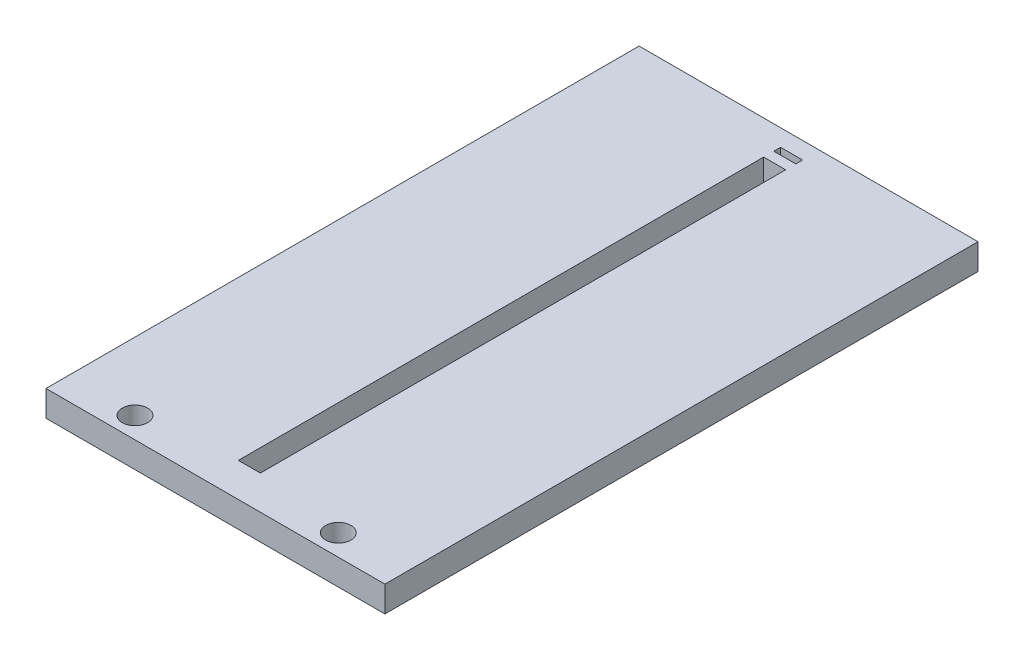
ISO-10303-21;
HEADER;
FILE_DESCRIPTION(('STEP AP214'),'2;1');
FILE_NAME('part.step','',(''),(''),'','','');
FILE_SCHEMA(('AUTOMOTIVE_DESIGN { 1 0 10303 214 1 1 1 1 }'));
ENDSEC;
DATA;
#1=APPLICATION_CONTEXT('core data for automotive mechanical design processes');
#2=APPLICATION_PROTOCOL_DEFINITION('international standard','automotive_design',2000,#1);
#3=PRODUCT_CONTEXT('',#1,'mechanical');
#4=PRODUCT('Part','Part','',(#3));
#5=PRODUCT_RELATED_PRODUCT_CATEGORY('part','',(#4));
#6=PRODUCT_DEFINITION_FORMATION('','',#4);
#7=PRODUCT_DEFINITION_CONTEXT('part definition',#1,'design');
#8=PRODUCT_DEFINITION('design','',#6,#7);
#9=PRODUCT_DEFINITION_SHAPE('','',#8);
#10=(LENGTH_UNIT() NAMED_UNIT(*) SI_UNIT(.MILLI.,.METRE.));
#11=(NAMED_UNIT(*) PLANE_ANGLE_UNIT() SI_UNIT($,.RADIAN.));
#12=(NAMED_UNIT(*) SI_UNIT($,.STERADIAN.) SOLID_ANGLE_UNIT());
#13=UNCERTAINTY_MEASURE_WITH_UNIT(LENGTH_MEASURE(1.E-05),#10,'distance_accuracy_value','');
#14=(GEOMETRIC_REPRESENTATION_CONTEXT(3) GLOBAL_UNCERTAINTY_ASSIGNED_CONTEXT((#13)) GLOBAL_UNIT_ASSIGNED_CONTEXT((#10,
#11,#12)) REPRESENTATION_CONTEXT('',''));
#15=CARTESIAN_POINT('',(0.,0.,0.));
#16=DIRECTION('',(0.,0.,1.));
#17=DIRECTION('',(1.,0.,0.));
#18=AXIS2_PLACEMENT_3D('',#15,#16,#17);
#19=CARTESIAN_POINT('',(0.,3.05,0.));
#20=DIRECTION('',(0.,0.,-1.));
#21=DIRECTION('',(-1.,0.,0.));
#22=AXIS2_PLACEMENT_3D('',#19,#20,#21);
#23=PLANE('',#22);
#24=DIRECTION('',(1.,0.,0.));
#25=VECTOR('',#24,1.);
#26=CARTESIAN_POINT('',(0.,0.,0.));
#27=LINE('',#26,#25);
#28=CARTESIAN_POINT('',(0.,0.,0.));
#29=VERTEX_POINT('',#28);
#30=CARTESIAN_POINT('',(40.,0.,0.));
#31=VERTEX_POINT('',#30);
#32=EDGE_CURVE('E172',#29,#31,#27,.T.);
#33=ORIENTED_EDGE('',*,*,#32,.T.);
#34=DIRECTION('',(0.,-1.,0.));
#35=VECTOR('',#34,1.);
#36=CARTESIAN_POINT('',(40.,3.05,0.));
#37=LINE('',#36,#35);
#38=CARTESIAN_POINT('',(40.,3.05,0.));
#39=VERTEX_POINT('',#38);
#40=EDGE_CURVE('E242',#39,#31,#37,.T.);
#41=ORIENTED_EDGE('',*,*,#40,.F.);
#42=DIRECTION('',(1.,0.,0.));
#43=VECTOR('',#42,1.);
#44=CARTESIAN_POINT('',(0.,3.05,0.));
#45=LINE('',#44,#43);
#46=CARTESIAN_POINT('',(0.,3.05,0.));
#47=VERTEX_POINT('',#46);
#48=EDGE_CURVE('E203',#47,#39,#45,.T.);
#49=ORIENTED_EDGE('',*,*,#48,.F.);
#50=DIRECTION('',(0.,-1.,0.));
#51=VECTOR('',#50,1.);
#52=CARTESIAN_POINT('',(0.,3.05,0.));
#53=LINE('',#52,#51);
#54=EDGE_CURVE('E219',#47,#29,#53,.T.);
#55=ORIENTED_EDGE('',*,*,#54,.T.);
#56=EDGE_LOOP('',(#33,#41,#49,#55));
#57=FACE_BOUND('',#56,.T.);
#58=ADVANCED_FACE('F45',(#57),#23,.F.);
#59=CARTESIAN_POINT('',(40.,3.05,0.));
#60=DIRECTION('',(-1.,0.,0.));
#61=DIRECTION('',(0.,0.,1.));
#62=AXIS2_PLACEMENT_3D('',#59,#60,#61);
#63=PLANE('',#62);
#64=DIRECTION('',(0.,0.,-1.));
#65=VECTOR('',#64,1.);
#66=CARTESIAN_POINT('',(40.,0.,0.));
#67=LINE('',#66,#65);
#68=CARTESIAN_POINT('',(40.,0.,-70.));
#69=VERTEX_POINT('',#68);
#70=EDGE_CURVE('E223',#31,#69,#67,.T.);
#71=ORIENTED_EDGE('',*,*,#70,.T.);
#72=DIRECTION('',(0.,-1.,0.));
#73=VECTOR('',#72,1.);
#74=CARTESIAN_POINT('',(40.,3.05,-70.));
#75=LINE('',#74,#73);
#76=CARTESIAN_POINT('',(40.,3.05,-70.));
#77=VERTEX_POINT('',#76);
#78=EDGE_CURVE('E239',#77,#69,#75,.T.);
#79=ORIENTED_EDGE('',*,*,#78,.F.);
#80=DIRECTION('',(0.,0.,-1.));
#81=VECTOR('',#80,1.);
#82=CARTESIAN_POINT('',(40.,3.05,0.));
#83=LINE('',#82,#81);
#84=EDGE_CURVE('E207',#39,#77,#83,.T.);
#85=ORIENTED_EDGE('',*,*,#84,.F.);
#86=ORIENTED_EDGE('',*,*,#40,.T.);
#87=EDGE_LOOP('',(#71,#79,#85,#86));
#88=FACE_BOUND('',#87,.T.);
#89=ADVANCED_FACE('F309',(#88),#63,.F.);
#90=CARTESIAN_POINT('',(0.,3.05,-70.));
#91=DIRECTION('',(0.,0.,-1.));
#92=DIRECTION('',(-1.,0.,0.));
#93=AXIS2_PLACEMENT_3D('',#90,#91,#92);
#94=PLANE('',#93);
#95=DIRECTION('',(1.,0.,0.));
#96=VECTOR('',#95,1.);
#97=CARTESIAN_POINT('',(0.,0.,-70.));
#98=LINE('',#97,#96);
#99=CARTESIAN_POINT('',(0.,0.,-70.));
#100=VERTEX_POINT('',#99);
#101=EDGE_CURVE('E227',#100,#69,#98,.T.);
#102=ORIENTED_EDGE('',*,*,#101,.F.);
#103=DIRECTION('',(0.,-1.,0.));
#104=VECTOR('',#103,1.);
#105=CARTESIAN_POINT('',(0.,3.05,-70.));
#106=LINE('',#105,#104);
#107=CARTESIAN_POINT('',(0.,3.05,-70.));
#108=VERTEX_POINT('',#107);
#109=EDGE_CURVE('E236',#108,#100,#106,.T.);
#110=ORIENTED_EDGE('',*,*,#109,.F.);
#111=DIRECTION('',(1.,0.,0.));
#112=VECTOR('',#111,1.);
#113=CARTESIAN_POINT('',(0.,3.05,-70.));
#114=LINE('',#113,#112);
#115=EDGE_CURVE('E211',#108,#77,#114,.T.);
#116=ORIENTED_EDGE('',*,*,#115,.T.);
#117=ORIENTED_EDGE('',*,*,#78,.T.);
#118=EDGE_LOOP('',(#102,#110,#116,#117));
#119=FACE_BOUND('',#118,.T.);
#120=ADVANCED_FACE('F304',(#119),#94,.T.);
#121=CARTESIAN_POINT('',(0.,3.05,0.));
#122=DIRECTION('',(-1.,0.,0.));
#123=DIRECTION('',(0.,0.,1.));
#124=AXIS2_PLACEMENT_3D('',#121,#122,#123);
#125=PLANE('',#124);
#126=DIRECTION('',(0.,0.,-1.));
#127=VECTOR('',#126,1.);
#128=CARTESIAN_POINT('',(0.,0.,0.));
#129=LINE('',#128,#127);
#130=EDGE_CURVE('E208',#29,#100,#129,.T.);
#131=ORIENTED_EDGE('',*,*,#130,.F.);
#132=ORIENTED_EDGE('',*,*,#54,.F.);
#133=DIRECTION('',(0.,0.,-1.));
#134=VECTOR('',#133,1.);
#135=CARTESIAN_POINT('',(0.,3.05,0.));
#136=LINE('',#135,#134);
#137=EDGE_CURVE('E215',#47,#108,#136,.T.);
#138=ORIENTED_EDGE('',*,*,#137,.T.);
#139=ORIENTED_EDGE('',*,*,#109,.T.);
#140=EDGE_LOOP('',(#131,#132,#138,#139));
#141=FACE_BOUND('',#140,.T.);
#142=ADVANCED_FACE('F294',(#141),#125,.T.);
#143=CARTESIAN_POINT('',(0.,3.05,0.));
#144=DIRECTION('',(0.,1.,0.));
#145=DIRECTION('',(0.,0.,1.));
#146=AXIS2_PLACEMENT_3D('',#143,#144,#145);
#147=PLANE('',#146);
#148=CARTESIAN_POINT('',(8.,3.05,-2.5));
#149=DIRECTION('',(0.,1.,0.));
#150=DIRECTION('',(0.,0.,1.));
#151=AXIS2_PLACEMENT_3D('',#148,#149,#150);
#152=CIRCLE('',#151,1.5);
#153=CARTESIAN_POINT('',(8.,3.05,-0.999999999999999));
#154=VERTEX_POINT('',#153);
#155=EDGE_CURVE('E272',#154,#154,#152,.T.);
#156=ORIENTED_EDGE('',*,*,#155,.F.);
#157=EDGE_LOOP('',(#156));
#158=FACE_BOUND('',#157,.T.);
#159=CARTESIAN_POINT('',(32.,3.05,-2.5));
#160=DIRECTION('',(0.,1.,0.));
#161=DIRECTION('',(0.,0.,1.));
#162=AXIS2_PLACEMENT_3D('',#159,#160,#161);
#163=CIRCLE('',#162,1.50000000000003);
#164=CARTESIAN_POINT('',(32.,3.05,-0.999999999999974));
#165=VERTEX_POINT('',#164);
#166=EDGE_CURVE('E279',#165,#165,#163,.T.);
#167=ORIENTED_EDGE('',*,*,#166,.F.);
#168=EDGE_LOOP('',(#167));
#169=FACE_BOUND('',#168,.T.);
#170=DIRECTION('',(1.,0.,0.));
#171=VECTOR('',#170,1.);
#172=CARTESIAN_POINT('',(0.,3.05,-4.));
#173=LINE('',#172,#171);
#174=CARTESIAN_POINT('',(18.7,3.05,-4.));
#175=VERTEX_POINT('',#174);
#176=CARTESIAN_POINT('',(21.3,3.05,-4.));
#177=VERTEX_POINT('',#176);
#178=EDGE_CURVE('E62',#175,#177,#173,.T.);
#179=ORIENTED_EDGE('',*,*,#178,.F.);
#180=DIRECTION('',(0.,0.,1.));
#181=VECTOR('',#180,1.);
#182=CARTESIAN_POINT('',(18.7,3.05,0.));
#183=LINE('',#182,#181);
#184=CARTESIAN_POINT('',(18.7,3.05,-66.));
#185=VERTEX_POINT('',#184);
#186=EDGE_CURVE('E162',#185,#175,#183,.T.);
#187=ORIENTED_EDGE('',*,*,#186,.F.);
#188=DIRECTION('',(-1.,0.,0.));
#189=VECTOR('',#188,1.);
#190=CARTESIAN_POINT('',(0.,3.05,-66.));
#191=LINE('',#190,#189);
#192=CARTESIAN_POINT('',(21.3,3.05,-66.));
#193=VERTEX_POINT('',#192);
#194=EDGE_CURVE('E143',#193,#185,#191,.T.);
#195=ORIENTED_EDGE('',*,*,#194,.F.);
#196=DIRECTION('',(0.,0.,-1.));
#197=VECTOR('',#196,1.);
#198=CARTESIAN_POINT('',(21.3,3.05,0.));
#199=LINE('',#198,#197);
#200=EDGE_CURVE('E154',#177,#193,#199,.T.);
#201=ORIENTED_EDGE('',*,*,#200,.F.);
#202=EDGE_LOOP('',(#179,#187,#195,#201));
#203=FACE_BOUND('',#202,.T.);
#204=DIRECTION('',(1.,0.,0.));
#205=VECTOR('',#204,1.);
#206=CARTESIAN_POINT('',(0.,3.05,-67.2));
#207=LINE('',#206,#205);
#208=CARTESIAN_POINT('',(18.7,3.05,-67.2));
#209=VERTEX_POINT('',#208);
#210=CARTESIAN_POINT('',(21.3,3.05,-67.2));
#211=VERTEX_POINT('',#210);
#212=EDGE_CURVE('E70',#209,#211,#207,.T.);
#213=ORIENTED_EDGE('',*,*,#212,.F.);
#214=DIRECTION('',(0.,0.,1.));
#215=VECTOR('',#214,1.);
#216=CARTESIAN_POINT('',(18.7,3.05,0.));
#217=LINE('',#216,#215);
#218=CARTESIAN_POINT('',(18.7,3.05,-68.));
#219=VERTEX_POINT('',#218);
#220=EDGE_CURVE('E187',#219,#209,#217,.T.);
#221=ORIENTED_EDGE('',*,*,#220,.F.);
#222=DIRECTION('',(-1.,0.,0.));
#223=VECTOR('',#222,1.);
#224=CARTESIAN_POINT('',(0.,3.05,-68.));
#225=LINE('',#224,#223);
#226=CARTESIAN_POINT('',(21.3,3.05,-68.));
#227=VERTEX_POINT('',#226);
#228=EDGE_CURVE('E183',#227,#219,#225,.T.);
#229=ORIENTED_EDGE('',*,*,#228,.F.);
#230=DIRECTION('',(0.,0.,-1.));
#231=VECTOR('',#230,1.);
#232=CARTESIAN_POINT('',(21.3,3.05,0.));
#233=LINE('',#232,#231);
#234=EDGE_CURVE('E179',#211,#227,#233,.T.);
#235=ORIENTED_EDGE('',*,*,#234,.F.);
#236=EDGE_LOOP('',(#213,#221,#229,#235));
#237=FACE_BOUND('',#236,.T.);
#238=ORIENTED_EDGE('',*,*,#48,.T.);
#239=ORIENTED_EDGE('',*,*,#84,.T.);
#240=ORIENTED_EDGE('',*,*,#115,.F.);
#241=ORIENTED_EDGE('',*,*,#137,.F.);
#242=EDGE_LOOP('',(#238,#239,#240,#241));
#243=FACE_BOUND('',#242,.T.);
#244=ADVANCED_FACE('F159',(#158,#169,#203,#237,#243),#147,.T.);
#245=CARTESIAN_POINT('',(0.,0.,0.));
#246=DIRECTION('',(0.,1.,0.));
#247=DIRECTION('',(0.,0.,1.));
#248=AXIS2_PLACEMENT_3D('',#245,#246,#247);
#249=PLANE('',#248);
#250=CARTESIAN_POINT('',(8.,0.,-2.5));
#251=DIRECTION('',(0.,1.,0.));
#252=DIRECTION('',(0.,0.,1.));
#253=AXIS2_PLACEMENT_3D('',#250,#251,#252);
#254=CIRCLE('',#253,1.5);
#255=CARTESIAN_POINT('',(8.,0.,-0.999999999999999));
#256=VERTEX_POINT('',#255);
#257=EDGE_CURVE('E48',#256,#256,#254,.T.);
#258=ORIENTED_EDGE('',*,*,#257,.T.);
#259=EDGE_LOOP('',(#258));
#260=FACE_BOUND('',#259,.T.);
#261=CARTESIAN_POINT('',(32.,0.,-2.5));
#262=DIRECTION('',(0.,1.,0.));
#263=DIRECTION('',(0.,0.,1.));
#264=AXIS2_PLACEMENT_3D('',#261,#262,#263);
#265=CIRCLE('',#264,1.50000000000003);
#266=CARTESIAN_POINT('',(32.,0.,-0.999999999999974));
#267=VERTEX_POINT('',#266);
#268=EDGE_CURVE('E269',#267,#267,#265,.T.);
#269=ORIENTED_EDGE('',*,*,#268,.T.);
#270=EDGE_LOOP('',(#269));
#271=FACE_BOUND('',#270,.T.);
#272=DIRECTION('',(0.,0.,1.));
#273=VECTOR('',#272,1.);
#274=CARTESIAN_POINT('',(18.7,0.,0.));
#275=LINE('',#274,#273);
#276=CARTESIAN_POINT('',(18.7,0.,-66.));
#277=VERTEX_POINT('',#276);
#278=CARTESIAN_POINT('',(18.7,0.,-4.));
#279=VERTEX_POINT('',#278);
#280=EDGE_CURVE('E54',#277,#279,#275,.T.);
#281=ORIENTED_EDGE('',*,*,#280,.T.);
#282=DIRECTION('',(1.,0.,0.));
#283=VECTOR('',#282,1.);
#284=CARTESIAN_POINT('',(0.,0.,-4.));
#285=LINE('',#284,#283);
#286=CARTESIAN_POINT('',(21.3,0.,-4.));
#287=VERTEX_POINT('',#286);
#288=EDGE_CURVE('E11',#279,#287,#285,.T.);
#289=ORIENTED_EDGE('',*,*,#288,.T.);
#290=DIRECTION('',(0.,0.,-1.));
#291=VECTOR('',#290,1.);
#292=CARTESIAN_POINT('',(21.3,0.,0.));
#293=LINE('',#292,#291);
#294=CARTESIAN_POINT('',(21.3,0.,-66.));
#295=VERTEX_POINT('',#294);
#296=EDGE_CURVE('E262',#287,#295,#293,.T.);
#297=ORIENTED_EDGE('',*,*,#296,.T.);
#298=DIRECTION('',(-1.,0.,0.));
#299=VECTOR('',#298,1.);
#300=CARTESIAN_POINT('',(0.,0.,-66.));
#301=LINE('',#300,#299);
#302=EDGE_CURVE('E146',#295,#277,#301,.T.);
#303=ORIENTED_EDGE('',*,*,#302,.T.);
#304=EDGE_LOOP('',(#281,#289,#297,#303));
#305=FACE_BOUND('',#304,.T.);
#306=DIRECTION('',(0.,0.,1.));
#307=VECTOR('',#306,1.);
#308=CARTESIAN_POINT('',(18.7,0.,0.));
#309=LINE('',#308,#307);
#310=CARTESIAN_POINT('',(18.7,0.,-68.));
#311=VERTEX_POINT('',#310);
#312=CARTESIAN_POINT('',(18.7,0.,-67.2));
#313=VERTEX_POINT('',#312);
#314=EDGE_CURVE('E254',#311,#313,#309,.T.);
#315=ORIENTED_EDGE('',*,*,#314,.T.);
#316=DIRECTION('',(1.,0.,0.));
#317=VECTOR('',#316,1.);
#318=CARTESIAN_POINT('',(0.,0.,-67.2));
#319=LINE('',#318,#317);
#320=CARTESIAN_POINT('',(21.3,0.,-67.2));
#321=VERTEX_POINT('',#320);
#322=EDGE_CURVE('E258',#313,#321,#319,.T.);
#323=ORIENTED_EDGE('',*,*,#322,.T.);
#324=DIRECTION('',(0.,0.,-1.));
#325=VECTOR('',#324,1.);
#326=CARTESIAN_POINT('',(21.3,0.,0.));
#327=LINE('',#326,#325);
#328=CARTESIAN_POINT('',(21.3,0.,-68.));
#329=VERTEX_POINT('',#328);
#330=EDGE_CURVE('E246',#321,#329,#327,.T.);
#331=ORIENTED_EDGE('',*,*,#330,.T.);
#332=DIRECTION('',(-1.,0.,0.));
#333=VECTOR('',#332,1.);
#334=CARTESIAN_POINT('',(0.,0.,-68.));
#335=LINE('',#334,#333);
#336=EDGE_CURVE('E250',#329,#311,#335,.T.);
#337=ORIENTED_EDGE('',*,*,#336,.T.);
#338=EDGE_LOOP('',(#315,#323,#331,#337));
#339=FACE_BOUND('',#338,.T.);
#340=ORIENTED_EDGE('',*,*,#32,.F.);
#341=ORIENTED_EDGE('',*,*,#130,.T.);
#342=ORIENTED_EDGE('',*,*,#101,.T.);
#343=ORIENTED_EDGE('',*,*,#70,.F.);
#344=EDGE_LOOP('',(#340,#341,#342,#343));
#345=FACE_BOUND('',#344,.T.);
#346=ADVANCED_FACE('F293',(#260,#271,#305,#339,#345),#249,.F.);
#347=CARTESIAN_POINT('',(0.,-6.95,-67.2));
#348=DIRECTION('',(0.,0.,1.));
#349=DIRECTION('',(1.,0.,0.));
#350=AXIS2_PLACEMENT_3D('',#347,#348,#349);
#351=PLANE('',#350);
#352=DIRECTION('',(0.,1.,0.));
#353=VECTOR('',#352,1.);
#354=CARTESIAN_POINT('',(18.7,-6.95,-67.2));
#355=LINE('',#354,#353);
#356=EDGE_CURVE('E192',#313,#209,#355,.T.);
#357=ORIENTED_EDGE('',*,*,#356,.T.);
#358=ORIENTED_EDGE('',*,*,#212,.T.);
#359=DIRECTION('',(0.,1.,0.));
#360=VECTOR('',#359,1.);
#361=CARTESIAN_POINT('',(21.3,-6.95,-67.2));
#362=LINE('',#361,#360);
#363=EDGE_CURVE('E191',#321,#211,#362,.T.);
#364=ORIENTED_EDGE('',*,*,#363,.F.);
#365=ORIENTED_EDGE('',*,*,#322,.F.);
#366=EDGE_LOOP('',(#357,#358,#364,#365));
#367=FACE_BOUND('',#366,.T.);
#368=ADVANCED_FACE('F301',(#367),#351,.F.);
#369=CARTESIAN_POINT('',(18.7,-6.95,0.));
#370=DIRECTION('',(-1.,0.,0.));
#371=DIRECTION('',(0.,0.,1.));
#372=AXIS2_PLACEMENT_3D('',#369,#370,#371);
#373=PLANE('',#372);
#374=DIRECTION('',(0.,1.,0.));
#375=VECTOR('',#374,1.);
#376=CARTESIAN_POINT('',(18.7,-6.95,-68.));
#377=LINE('',#376,#375);
#378=EDGE_CURVE('E195',#311,#219,#377,.T.);
#379=ORIENTED_EDGE('',*,*,#378,.T.);
#380=ORIENTED_EDGE('',*,*,#220,.T.);
#381=ORIENTED_EDGE('',*,*,#356,.F.);
#382=ORIENTED_EDGE('',*,*,#314,.F.);
#383=EDGE_LOOP('',(#379,#380,#381,#382));
#384=FACE_BOUND('',#383,.T.);
#385=ADVANCED_FACE('F347',(#384),#373,.F.);
#386=CARTESIAN_POINT('',(0.,-6.95,-68.));
#387=DIRECTION('',(0.,0.,-1.));
#388=DIRECTION('',(-1.,0.,0.));
#389=AXIS2_PLACEMENT_3D('',#386,#387,#388);
#390=PLANE('',#389);
#391=DIRECTION('',(0.,1.,0.));
#392=VECTOR('',#391,1.);
#393=CARTESIAN_POINT('',(21.3,-6.95,-68.));
#394=LINE('',#393,#392);
#395=EDGE_CURVE('E198',#329,#227,#394,.T.);
#396=ORIENTED_EDGE('',*,*,#395,.T.);
#397=ORIENTED_EDGE('',*,*,#228,.T.);
#398=ORIENTED_EDGE('',*,*,#378,.F.);
#399=ORIENTED_EDGE('',*,*,#336,.F.);
#400=EDGE_LOOP('',(#396,#397,#398,#399));
#401=FACE_BOUND('',#400,.T.);
#402=ADVANCED_FACE('F357',(#401),#390,.F.);
#403=CARTESIAN_POINT('',(21.3,-6.95,0.));
#404=DIRECTION('',(1.,0.,0.));
#405=DIRECTION('',(0.,0.,-1.));
#406=AXIS2_PLACEMENT_3D('',#403,#404,#405);
#407=PLANE('',#406);
#408=ORIENTED_EDGE('',*,*,#363,.T.);
#409=ORIENTED_EDGE('',*,*,#234,.T.);
#410=ORIENTED_EDGE('',*,*,#395,.F.);
#411=ORIENTED_EDGE('',*,*,#330,.F.);
#412=EDGE_LOOP('',(#408,#409,#410,#411));
#413=FACE_BOUND('',#412,.T.);
#414=ADVANCED_FACE('F368',(#413),#407,.F.);
#415=CARTESIAN_POINT('',(0.,-6.95,-4.));
#416=DIRECTION('',(0.,0.,1.));
#417=DIRECTION('',(1.,0.,0.));
#418=AXIS2_PLACEMENT_3D('',#415,#416,#417);
#419=PLANE('',#418);
#420=DIRECTION('',(0.,1.,0.));
#421=VECTOR('',#420,1.);
#422=CARTESIAN_POINT('',(18.7,-6.95,-4.));
#423=LINE('',#422,#421);
#424=EDGE_CURVE('E169',#279,#175,#423,.T.);
#425=ORIENTED_EDGE('',*,*,#424,.T.);
#426=ORIENTED_EDGE('',*,*,#178,.T.);
#427=DIRECTION('',(0.,1.,0.));
#428=VECTOR('',#427,1.);
#429=CARTESIAN_POINT('',(21.3,-6.95,-4.));
#430=LINE('',#429,#428);
#431=EDGE_CURVE('E151',#287,#177,#430,.T.);
#432=ORIENTED_EDGE('',*,*,#431,.F.);
#433=ORIENTED_EDGE('',*,*,#288,.F.);
#434=EDGE_LOOP('',(#425,#426,#432,#433));
#435=FACE_BOUND('',#434,.T.);
#436=ADVANCED_FACE('F379',(#435),#419,.F.);
#437=CARTESIAN_POINT('',(18.7,-6.95,0.));
#438=DIRECTION('',(-1.,0.,0.));
#439=DIRECTION('',(0.,0.,1.));
#440=AXIS2_PLACEMENT_3D('',#437,#438,#439);
#441=PLANE('',#440);
#442=DIRECTION('',(0.,1.,0.));
#443=VECTOR('',#442,1.);
#444=CARTESIAN_POINT('',(18.7,-6.95,-66.));
#445=LINE('',#444,#443);
#446=EDGE_CURVE('E150',#277,#185,#445,.T.);
#447=ORIENTED_EDGE('',*,*,#446,.T.);
#448=ORIENTED_EDGE('',*,*,#186,.T.);
#449=ORIENTED_EDGE('',*,*,#424,.F.);
#450=ORIENTED_EDGE('',*,*,#280,.F.);
#451=EDGE_LOOP('',(#447,#448,#449,#450));
#452=FACE_BOUND('',#451,.T.);
#453=ADVANCED_FACE('F390',(#452),#441,.F.);
#454=CARTESIAN_POINT('',(0.,-6.95,-66.));
#455=DIRECTION('',(0.,0.,-1.));
#456=DIRECTION('',(-1.,0.,0.));
#457=AXIS2_PLACEMENT_3D('',#454,#455,#456);
#458=PLANE('',#457);
#459=DIRECTION('',(0.,1.,0.));
#460=VECTOR('',#459,1.);
#461=CARTESIAN_POINT('',(21.3,-6.95,-66.));
#462=LINE('',#461,#460);
#463=EDGE_CURVE('E138',#295,#193,#462,.T.);
#464=ORIENTED_EDGE('',*,*,#463,.T.);
#465=ORIENTED_EDGE('',*,*,#194,.T.);
#466=ORIENTED_EDGE('',*,*,#446,.F.);
#467=ORIENTED_EDGE('',*,*,#302,.F.);
#468=EDGE_LOOP('',(#464,#465,#466,#467));
#469=FACE_BOUND('',#468,.T.);
#470=ADVANCED_FACE('F140',(#469),#458,.F.);
#471=CARTESIAN_POINT('',(21.3,-6.95,0.));
#472=DIRECTION('',(1.,0.,0.));
#473=DIRECTION('',(0.,0.,-1.));
#474=AXIS2_PLACEMENT_3D('',#471,#472,#473);
#475=PLANE('',#474);
#476=ORIENTED_EDGE('',*,*,#431,.T.);
#477=ORIENTED_EDGE('',*,*,#200,.T.);
#478=ORIENTED_EDGE('',*,*,#463,.F.);
#479=ORIENTED_EDGE('',*,*,#296,.F.);
#480=EDGE_LOOP('',(#476,#477,#478,#479));
#481=FACE_BOUND('',#480,.T.);
#482=ADVANCED_FACE('F155',(#481),#475,.F.);
#483=CARTESIAN_POINT('',(32.,-6.95,-2.5));
#484=DIRECTION('',(0.,1.,0.));
#485=DIRECTION('',(0.,0.,1.));
#486=AXIS2_PLACEMENT_3D('',#483,#484,#485);
#487=CYLINDRICAL_SURFACE('',#486,1.50000000000003);
#488=ORIENTED_EDGE('',*,*,#166,.T.);
#489=EDGE_LOOP('',(#488));
#490=FACE_BOUND('',#489,.T.);
#491=ORIENTED_EDGE('',*,*,#268,.F.);
#492=EDGE_LOOP('',(#491));
#493=FACE_BOUND('',#492,.T.);
#494=ADVANCED_FACE('F289',(#490,#493),#487,.F.);
#495=CARTESIAN_POINT('',(8.,-6.95,-2.5));
#496=DIRECTION('',(0.,1.,0.));
#497=DIRECTION('',(0.,0.,1.));
#498=AXIS2_PLACEMENT_3D('',#495,#496,#497);
#499=CYLINDRICAL_SURFACE('',#498,1.5);
#500=ORIENTED_EDGE('',*,*,#155,.T.);
#501=EDGE_LOOP('',(#500));
#502=FACE_BOUND('',#501,.T.);
#503=ORIENTED_EDGE('',*,*,#257,.F.);
#504=EDGE_LOOP('',(#503));
#505=FACE_BOUND('',#504,.T.);
#506=ADVANCED_FACE('F438',(#502,#505),#499,.F.);
#507=CLOSED_SHELL('',(#58,#89,#120,#142,#244,#346,#368,#385,#402,#414,#436,#453,#470,#482,#494,#506));
#508=MANIFOLD_SOLID_BREP('B2',#507);
#509=ADVANCED_BREP_SHAPE_REPRESENTATION('',(#18,#508),#14);
#510=SHAPE_DEFINITION_REPRESENTATION(#9,#509);
ENDSEC;
END-ISO-10303-21;
